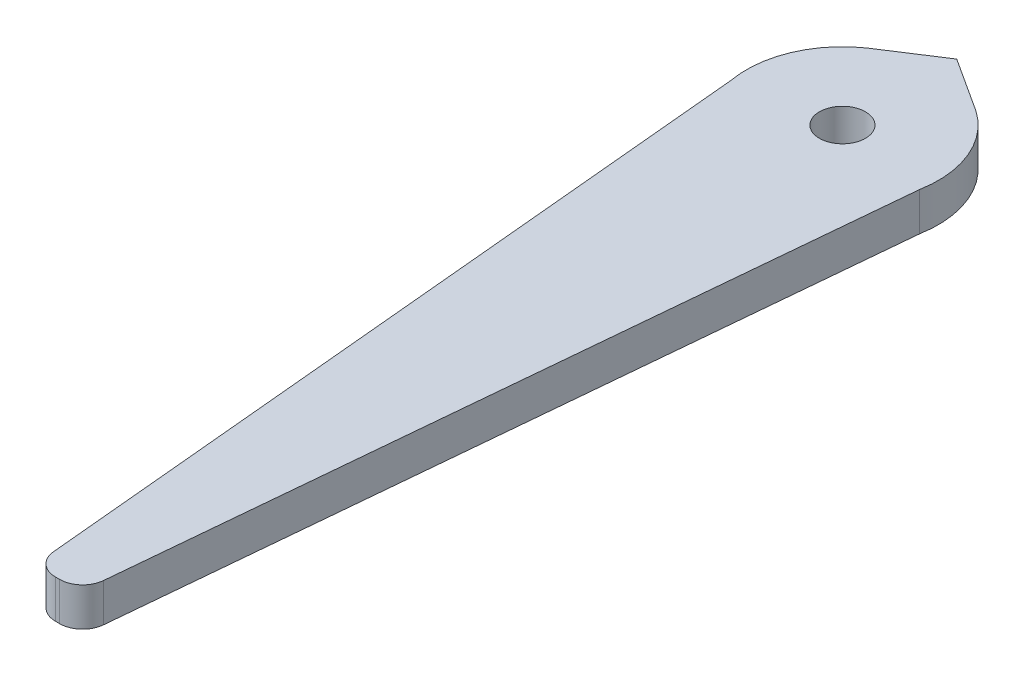
ISO-10303-21;
HEADER;
FILE_DESCRIPTION(('STEP AP214'),'2;1');
FILE_NAME('part.step','',(''),(''),'','','');
FILE_SCHEMA(('AUTOMOTIVE_DESIGN { 1 0 10303 214 1 1 1 1 }'));
ENDSEC;
DATA;
#1=APPLICATION_CONTEXT('core data for automotive mechanical design processes');
#2=APPLICATION_PROTOCOL_DEFINITION('international standard','automotive_design',2000,#1);
#3=PRODUCT_CONTEXT('',#1,'mechanical');
#4=PRODUCT('Part','Part','',(#3));
#5=PRODUCT_RELATED_PRODUCT_CATEGORY('part','',(#4));
#6=PRODUCT_DEFINITION_FORMATION('','',#4);
#7=PRODUCT_DEFINITION_CONTEXT('part definition',#1,'design');
#8=PRODUCT_DEFINITION('design','',#6,#7);
#9=PRODUCT_DEFINITION_SHAPE('','',#8);
#10=(LENGTH_UNIT() NAMED_UNIT(*) SI_UNIT(.MILLI.,.METRE.));
#11=(NAMED_UNIT(*) PLANE_ANGLE_UNIT() SI_UNIT($,.RADIAN.));
#12=(NAMED_UNIT(*) SI_UNIT($,.STERADIAN.) SOLID_ANGLE_UNIT());
#13=UNCERTAINTY_MEASURE_WITH_UNIT(LENGTH_MEASURE(1.E-05),#10,'distance_accuracy_value','');
#14=(GEOMETRIC_REPRESENTATION_CONTEXT(3) GLOBAL_UNCERTAINTY_ASSIGNED_CONTEXT((#13)) GLOBAL_UNIT_ASSIGNED_CONTEXT((#10,
#11,#12)) REPRESENTATION_CONTEXT('',''));
#15=CARTESIAN_POINT('',(0.,0.,0.));
#16=DIRECTION('',(0.,0.,1.));
#17=DIRECTION('',(1.,0.,0.));
#18=AXIS2_PLACEMENT_3D('',#15,#16,#17);
#19=CARTESIAN_POINT('',(-0.868497324803818,5.,-198.583153997755));
#20=DIRECTION('',(0.,1.,0.));
#21=DIRECTION('',(0.,0.,1.));
#22=AXIS2_PLACEMENT_3D('',#19,#20,#21);
#23=PLANE('',#22);
#24=DIRECTION('',(0.0925848011404224,0.,0.995704802940002));
#25=VECTOR('',#24,1.);
#26=CARTESIAN_POINT('',(-13.1669159793135,5.,-196.347332314702));
#27=LINE('',#26,#25);
#28=CARTESIAN_POINT('',(-13.1669159793135,5.,-196.347332314702));
#29=VERTEX_POINT('',#28);
#30=CARTESIAN_POINT('',(-4.12077936453641,5.,-99.0605037592925));
#31=VERTEX_POINT('',#30);
#32=EDGE_CURVE('E147',#29,#31,#27,.T.);
#33=ORIENTED_EDGE('',*,*,#32,.T.);
#34=CARTESIAN_POINT('',(-1.1436220037458,5.,-99.3373323147023));
#35=DIRECTION('',(0.,1.,0.));
#36=DIRECTION('',(0.,0.,1.));
#37=AXIS2_PLACEMENT_3D('',#34,#35,#36);
#38=CIRCLE('',#37,2.99);
#39=CARTESIAN_POINT('',(-1.1436220037458,5.,-96.3473323147023));
#40=VERTEX_POINT('',#39);
#41=EDGE_CURVE('E40',#31,#40,#38,.T.);
#42=ORIENTED_EDGE('',*,*,#41,.T.);
#43=DIRECTION('',(1.,0.,0.));
#44=VECTOR('',#43,1.);
#45=CARTESIAN_POINT('',(-3.86849732480381,5.,-96.3473323147023));
#46=LINE('',#45,#44);
#47=CARTESIAN_POINT('',(-0.593372645861814,5.,-96.3473323147023));
#48=VERTEX_POINT('',#47);
#49=EDGE_CURVE('E146',#40,#48,#46,.T.);
#50=ORIENTED_EDGE('',*,*,#49,.T.);
#51=CARTESIAN_POINT('',(-0.593372645861814,5.,-99.3373323147023));
#52=DIRECTION('',(0.,1.,0.));
#53=DIRECTION('',(0.,0.,1.));
#54=AXIS2_PLACEMENT_3D('',#51,#52,#53);
#55=CIRCLE('',#54,2.99);
#56=CARTESIAN_POINT('',(2.38378471492879,5.,-99.0605037592924));
#57=VERTEX_POINT('',#56);
#58=EDGE_CURVE('E47',#48,#57,#55,.T.);
#59=ORIENTED_EDGE('',*,*,#58,.T.);
#60=DIRECTION('',(0.0925848011404221,0.,-0.995704802940002));
#61=VECTOR('',#60,1.);
#62=CARTESIAN_POINT('',(2.13150267519619,5.,-96.3473323147023));
#63=LINE('',#62,#61);
#64=CARTESIAN_POINT('',(11.4299213297059,5.,-196.347332314702));
#65=VERTEX_POINT('',#64);
#66=EDGE_CURVE('E120',#57,#65,#63,.T.);
#67=ORIENTED_EDGE('',*,*,#66,.T.);
#68=CARTESIAN_POINT('',(-0.868497324803818,5.,-198.583153997755));
#69=DIRECTION('',(0.,1.,0.));
#70=DIRECTION('',(0.,0.,1.));
#71=AXIS2_PLACEMENT_3D('',#68,#69,#70);
#72=CIRCLE('',#71,12.5);
#73=CARTESIAN_POINT('',(6.22566236907417,5.,-208.875039065018));
#74=VERTEX_POINT('',#73);
#75=EDGE_CURVE('E116',#65,#74,#72,.T.);
#76=ORIENTED_EDGE('',*,*,#75,.T.);
#77=DIRECTION('',(-0.8392996785331,0.,-0.543669062587008));
#78=VECTOR('',#77,1.);
#79=CARTESIAN_POINT('',(-0.86849732480382,5.,-213.470388317807));
#80=LINE('',#79,#78);
#81=CARTESIAN_POINT('',(-0.86849732480382,5.,-213.470388317807));
#82=VERTEX_POINT('',#81);
#83=EDGE_CURVE('E106',#74,#82,#80,.T.);
#84=ORIENTED_EDGE('',*,*,#83,.T.);
#85=DIRECTION('',(-0.839299678533099,0.,0.543669062587009));
#86=VECTOR('',#85,1.);
#87=CARTESIAN_POINT('',(-7.96265701868184,5.,-208.875039065018));
#88=LINE('',#87,#86);
#89=CARTESIAN_POINT('',(-7.96265701868184,5.,-208.875039065018));
#90=VERTEX_POINT('',#89);
#91=EDGE_CURVE('E115',#82,#90,#88,.T.);
#92=ORIENTED_EDGE('',*,*,#91,.T.);
#93=CARTESIAN_POINT('',(-0.868497324803818,5.,-198.583153997755));
#94=DIRECTION('',(0.,1.,0.));
#95=DIRECTION('',(0.,0.,1.));
#96=AXIS2_PLACEMENT_3D('',#93,#94,#95);
#97=CIRCLE('',#96,12.5);
#98=EDGE_CURVE('E183',#90,#29,#97,.T.);
#99=ORIENTED_EDGE('',*,*,#98,.T.);
#100=EDGE_LOOP('',(#33,#42,#50,#59,#67,#76,#84,#92,#99));
#101=FACE_BOUND('',#100,.T.);
#102=CARTESIAN_POINT('',(-0.868497324803818,5.,-198.583153997755));
#103=DIRECTION('',(0.,1.,0.));
#104=DIRECTION('',(0.,0.,1.));
#105=AXIS2_PLACEMENT_3D('',#102,#103,#104);
#106=CIRCLE('',#105,3.00000000012173);
#107=CARTESIAN_POINT('',(-0.868497324803818,5.,-195.583153997633));
#108=VERTEX_POINT('',#107);
#109=EDGE_CURVE('E190',#108,#108,#106,.T.);
#110=ORIENTED_EDGE('',*,*,#109,.F.);
#111=EDGE_LOOP('',(#110));
#112=FACE_BOUND('',#111,.T.);
#113=ADVANCED_FACE('F32',(#101,#112),#23,.T.);
#114=CARTESIAN_POINT('',(-0.868497324803818,0.,-198.583153997755));
#115=DIRECTION('',(0.,1.,0.));
#116=DIRECTION('',(0.,0.,1.));
#117=AXIS2_PLACEMENT_3D('',#114,#115,#116);
#118=PLANE('',#117);
#119=DIRECTION('',(1.,0.,0.));
#120=VECTOR('',#119,1.);
#121=CARTESIAN_POINT('',(-3.86849732480381,0.,-96.3473323147023));
#122=LINE('',#121,#120);
#123=CARTESIAN_POINT('',(-1.1436220037458,0.,-96.3473323147023));
#124=VERTEX_POINT('',#123);
#125=CARTESIAN_POINT('',(-0.593372645861814,0.,-96.3473323147023));
#126=VERTEX_POINT('',#125);
#127=EDGE_CURVE('E163',#124,#126,#122,.T.);
#128=ORIENTED_EDGE('',*,*,#127,.F.);
#129=CARTESIAN_POINT('',(-1.1436220037458,0.,-99.3373323147023));
#130=DIRECTION('',(0.,1.,0.));
#131=DIRECTION('',(0.,0.,1.));
#132=AXIS2_PLACEMENT_3D('',#129,#130,#131);
#133=CIRCLE('',#132,2.99);
#134=CARTESIAN_POINT('',(-4.12077936453641,0.,-99.0605037592925));
#135=VERTEX_POINT('',#134);
#136=EDGE_CURVE('E141',#124,#135,#133,.F.);
#137=ORIENTED_EDGE('',*,*,#136,.T.);
#138=DIRECTION('',(0.0925848011404224,0.,0.995704802940002));
#139=VECTOR('',#138,1.);
#140=CARTESIAN_POINT('',(-13.1669159793135,0.,-196.347332314702));
#141=LINE('',#140,#139);
#142=CARTESIAN_POINT('',(-13.1669159793135,0.,-196.347332314702));
#143=VERTEX_POINT('',#142);
#144=EDGE_CURVE('E162',#143,#135,#141,.T.);
#145=ORIENTED_EDGE('',*,*,#144,.F.);
#146=CARTESIAN_POINT('',(-0.868497324803818,0.,-198.583153997755));
#147=DIRECTION('',(0.,1.,0.));
#148=DIRECTION('',(0.,0.,1.));
#149=AXIS2_PLACEMENT_3D('',#146,#147,#148);
#150=CIRCLE('',#149,12.5);
#151=CARTESIAN_POINT('',(-7.96265701868184,0.,-208.875039065018));
#152=VERTEX_POINT('',#151);
#153=EDGE_CURVE('E168',#152,#143,#150,.T.);
#154=ORIENTED_EDGE('',*,*,#153,.F.);
#155=DIRECTION('',(-0.839299678533099,0.,0.543669062587009));
#156=VECTOR('',#155,1.);
#157=CARTESIAN_POINT('',(-7.96265701868184,0.,-208.875039065018));
#158=LINE('',#157,#156);
#159=CARTESIAN_POINT('',(-0.86849732480382,0.,-213.470388317807));
#160=VERTEX_POINT('',#159);
#161=EDGE_CURVE('E171',#160,#152,#158,.T.);
#162=ORIENTED_EDGE('',*,*,#161,.F.);
#163=DIRECTION('',(-0.8392996785331,0.,-0.543669062587008));
#164=VECTOR('',#163,1.);
#165=CARTESIAN_POINT('',(-0.86849732480382,0.,-213.470388317807));
#166=LINE('',#165,#164);
#167=CARTESIAN_POINT('',(6.22566236907417,0.,-208.875039065018));
#168=VERTEX_POINT('',#167);
#169=EDGE_CURVE('E186',#168,#160,#166,.T.);
#170=ORIENTED_EDGE('',*,*,#169,.F.);
#171=CARTESIAN_POINT('',(-0.868497324803818,0.,-198.583153997755));
#172=DIRECTION('',(0.,1.,0.));
#173=DIRECTION('',(0.,0.,1.));
#174=AXIS2_PLACEMENT_3D('',#171,#172,#173);
#175=CIRCLE('',#174,12.5);
#176=CARTESIAN_POINT('',(11.4299213297059,0.,-196.347332314702));
#177=VERTEX_POINT('',#176);
#178=EDGE_CURVE('E128',#177,#168,#175,.T.);
#179=ORIENTED_EDGE('',*,*,#178,.F.);
#180=DIRECTION('',(0.0925848011404221,0.,-0.995704802940002));
#181=VECTOR('',#180,1.);
#182=CARTESIAN_POINT('',(2.13150267519619,0.,-96.3473323147023));
#183=LINE('',#182,#181);
#184=CARTESIAN_POINT('',(2.38378471492879,0.,-99.0605037592924));
#185=VERTEX_POINT('',#184);
#186=EDGE_CURVE('E124',#185,#177,#183,.T.);
#187=ORIENTED_EDGE('',*,*,#186,.F.);
#188=CARTESIAN_POINT('',(-0.593372645861814,0.,-99.3373323147023));
#189=DIRECTION('',(0.,1.,0.));
#190=DIRECTION('',(0.,0.,1.));
#191=AXIS2_PLACEMENT_3D('',#188,#189,#190);
#192=CIRCLE('',#191,2.99);
#193=EDGE_CURVE('E139',#185,#126,#192,.F.);
#194=ORIENTED_EDGE('',*,*,#193,.T.);
#195=EDGE_LOOP('',(#128,#137,#145,#154,#162,#170,#179,#187,#194));
#196=FACE_BOUND('',#195,.T.);
#197=CARTESIAN_POINT('',(-0.868497324803818,0.,-198.583153997755));
#198=DIRECTION('',(0.,1.,0.));
#199=DIRECTION('',(0.,0.,1.));
#200=AXIS2_PLACEMENT_3D('',#197,#198,#199);
#201=CIRCLE('',#200,3.00000000012173);
#202=CARTESIAN_POINT('',(-0.868497324803818,0.,-195.583153997633));
#203=VERTEX_POINT('',#202);
#204=EDGE_CURVE('E195',#203,#203,#201,.T.);
#205=ORIENTED_EDGE('',*,*,#204,.T.);
#206=EDGE_LOOP('',(#205));
#207=FACE_BOUND('',#206,.T.);
#208=ADVANCED_FACE('F159',(#196,#207),#118,.F.);
#209=CARTESIAN_POINT('',(-0.868497324803818,5.,-198.583153997755));
#210=DIRECTION('',(0.,-1.,0.));
#211=DIRECTION('',(0.,0.,-1.));
#212=AXIS2_PLACEMENT_3D('',#209,#210,#211);
#213=CYLINDRICAL_SURFACE('',#212,12.5);
#214=ORIENTED_EDGE('',*,*,#178,.T.);
#215=DIRECTION('',(0.,-1.,0.));
#216=VECTOR('',#215,1.);
#217=CARTESIAN_POINT('',(6.22566236907417,5.,-208.875039065018));
#218=LINE('',#217,#216);
#219=EDGE_CURVE('E110',#74,#168,#218,.T.);
#220=ORIENTED_EDGE('',*,*,#219,.F.);
#221=ORIENTED_EDGE('',*,*,#75,.F.);
#222=DIRECTION('',(0.,-1.,0.));
#223=VECTOR('',#222,1.);
#224=CARTESIAN_POINT('',(11.4299213297059,5.,-196.347332314702));
#225=LINE('',#224,#223);
#226=EDGE_CURVE('E176',#65,#177,#225,.T.);
#227=ORIENTED_EDGE('',*,*,#226,.T.);
#228=EDGE_LOOP('',(#214,#220,#221,#227));
#229=FACE_BOUND('',#228,.T.);
#230=ADVANCED_FACE('F126',(#229),#213,.T.);
#231=CARTESIAN_POINT('',(-0.86849732480382,5.,-213.470388317807));
#232=DIRECTION('',(-0.543669062587008,0.,0.8392996785331));
#233=DIRECTION('',(0.8392996785331,0.,0.543669062587008));
#234=AXIS2_PLACEMENT_3D('',#231,#232,#233);
#235=PLANE('',#234);
#236=ORIENTED_EDGE('',*,*,#169,.T.);
#237=DIRECTION('',(0.,-1.,0.));
#238=VECTOR('',#237,1.);
#239=CARTESIAN_POINT('',(-0.86849732480382,5.,-213.470388317807));
#240=LINE('',#239,#238);
#241=EDGE_CURVE('E113',#82,#160,#240,.T.);
#242=ORIENTED_EDGE('',*,*,#241,.F.);
#243=ORIENTED_EDGE('',*,*,#83,.F.);
#244=ORIENTED_EDGE('',*,*,#219,.T.);
#245=EDGE_LOOP('',(#236,#242,#243,#244));
#246=FACE_BOUND('',#245,.T.);
#247=ADVANCED_FACE('F108',(#246),#235,.F.);
#248=CARTESIAN_POINT('',(-7.96265701868184,5.,-208.875039065018));
#249=DIRECTION('',(0.543669062587009,0.,0.839299678533099));
#250=DIRECTION('',(0.839299678533099,0.,-0.543669062587009));
#251=AXIS2_PLACEMENT_3D('',#248,#249,#250);
#252=PLANE('',#251);
#253=ORIENTED_EDGE('',*,*,#161,.T.);
#254=DIRECTION('',(0.,-1.,0.));
#255=VECTOR('',#254,1.);
#256=CARTESIAN_POINT('',(-7.96265701868184,5.,-208.875039065018));
#257=LINE('',#256,#255);
#258=EDGE_CURVE('E133',#90,#152,#257,.T.);
#259=ORIENTED_EDGE('',*,*,#258,.F.);
#260=ORIENTED_EDGE('',*,*,#91,.F.);
#261=ORIENTED_EDGE('',*,*,#241,.T.);
#262=EDGE_LOOP('',(#253,#259,#260,#261));
#263=FACE_BOUND('',#262,.T.);
#264=ADVANCED_FACE('F221',(#263),#252,.F.);
#265=CARTESIAN_POINT('',(-0.868497324803818,5.,-198.583153997755));
#266=DIRECTION('',(0.,-1.,0.));
#267=DIRECTION('',(0.,0.,-1.));
#268=AXIS2_PLACEMENT_3D('',#265,#266,#267);
#269=CYLINDRICAL_SURFACE('',#268,12.5);
#270=ORIENTED_EDGE('',*,*,#153,.T.);
#271=DIRECTION('',(0.,-1.,0.));
#272=VECTOR('',#271,1.);
#273=CARTESIAN_POINT('',(-13.1669159793135,5.,-196.347332314702));
#274=LINE('',#273,#272);
#275=EDGE_CURVE('E167',#29,#143,#274,.T.);
#276=ORIENTED_EDGE('',*,*,#275,.F.);
#277=ORIENTED_EDGE('',*,*,#98,.F.);
#278=ORIENTED_EDGE('',*,*,#258,.T.);
#279=EDGE_LOOP('',(#270,#276,#277,#278));
#280=FACE_BOUND('',#279,.T.);
#281=ADVANCED_FACE('F182',(#280),#269,.T.);
#282=CARTESIAN_POINT('',(-13.1669159793135,5.,-196.347332314702));
#283=DIRECTION('',(0.995704802940002,0.,-0.0925848011404224));
#284=DIRECTION('',(-0.0925848011404224,0.,-0.995704802940002));
#285=AXIS2_PLACEMENT_3D('',#282,#283,#284);
#286=PLANE('',#285);
#287=ORIENTED_EDGE('',*,*,#144,.T.);
#288=DIRECTION('',(0.,-1.,0.));
#289=VECTOR('',#288,1.);
#290=CARTESIAN_POINT('',(-4.12077936453641,5.,-99.0605037592925));
#291=LINE('',#290,#289);
#292=EDGE_CURVE('E55',#135,#31,#291,.F.);
#293=ORIENTED_EDGE('',*,*,#292,.T.);
#294=ORIENTED_EDGE('',*,*,#32,.F.);
#295=ORIENTED_EDGE('',*,*,#275,.T.);
#296=EDGE_LOOP('',(#287,#293,#294,#295));
#297=FACE_BOUND('',#296,.T.);
#298=ADVANCED_FACE('F165',(#297),#286,.F.);
#299=CARTESIAN_POINT('',(-3.86849732480381,5.,-96.3473323147023));
#300=DIRECTION('',(0.,0.,-1.));
#301=DIRECTION('',(-1.,0.,0.));
#302=AXIS2_PLACEMENT_3D('',#299,#300,#301);
#303=PLANE('',#302);
#304=ORIENTED_EDGE('',*,*,#49,.F.);
#305=DIRECTION('',(0.,-1.,0.));
#306=VECTOR('',#305,1.);
#307=CARTESIAN_POINT('',(-1.1436220037458,5.,-96.3473323147023));
#308=LINE('',#307,#306);
#309=EDGE_CURVE('E131',#40,#124,#308,.T.);
#310=ORIENTED_EDGE('',*,*,#309,.T.);
#311=ORIENTED_EDGE('',*,*,#127,.T.);
#312=DIRECTION('',(0.,-1.,0.));
#313=VECTOR('',#312,1.);
#314=CARTESIAN_POINT('',(-0.593372645861814,5.,-96.3473323147023));
#315=LINE('',#314,#313);
#316=EDGE_CURVE('E129',#126,#48,#315,.F.);
#317=ORIENTED_EDGE('',*,*,#316,.T.);
#318=EDGE_LOOP('',(#304,#310,#311,#317));
#319=FACE_BOUND('',#318,.T.);
#320=ADVANCED_FACE('F151',(#319),#303,.F.);
#321=CARTESIAN_POINT('',(2.13150267519619,5.,-96.3473323147023));
#322=DIRECTION('',(-0.995704802940002,0.,-0.0925848011404221));
#323=DIRECTION('',(-0.0925848011404221,0.,0.995704802940002));
#324=AXIS2_PLACEMENT_3D('',#321,#322,#323);
#325=PLANE('',#324);
#326=ORIENTED_EDGE('',*,*,#66,.F.);
#327=DIRECTION('',(0.,-1.,0.));
#328=VECTOR('',#327,1.);
#329=CARTESIAN_POINT('',(2.38378471492879,5.,-99.0605037592924));
#330=LINE('',#329,#328);
#331=EDGE_CURVE('E11',#57,#185,#330,.T.);
#332=ORIENTED_EDGE('',*,*,#331,.T.);
#333=ORIENTED_EDGE('',*,*,#186,.T.);
#334=ORIENTED_EDGE('',*,*,#226,.F.);
#335=EDGE_LOOP('',(#326,#332,#333,#334));
#336=FACE_BOUND('',#335,.T.);
#337=ADVANCED_FACE('F211',(#336),#325,.F.);
#338=CARTESIAN_POINT('',(-0.868497324803818,5.,-198.583153997755));
#339=DIRECTION('',(0.,-1.,0.));
#340=DIRECTION('',(0.,0.,-1.));
#341=AXIS2_PLACEMENT_3D('',#338,#339,#340);
#342=CYLINDRICAL_SURFACE('',#341,3.00000000012173);
#343=ORIENTED_EDGE('',*,*,#109,.T.);
#344=EDGE_LOOP('',(#343));
#345=FACE_BOUND('',#344,.T.);
#346=ORIENTED_EDGE('',*,*,#204,.F.);
#347=EDGE_LOOP('',(#346));
#348=FACE_BOUND('',#347,.T.);
#349=ADVANCED_FACE('F201',(#345,#348),#342,.F.);
#350=CARTESIAN_POINT('',(-1.1436220037458,5.,-99.3373323147023));
#351=DIRECTION('',(0.,-1.,0.));
#352=DIRECTION('',(0.,0.,-1.));
#353=AXIS2_PLACEMENT_3D('',#350,#351,#352);
#354=CYLINDRICAL_SURFACE('',#353,2.99);
#355=ORIENTED_EDGE('',*,*,#41,.F.);
#356=ORIENTED_EDGE('',*,*,#292,.F.);
#357=ORIENTED_EDGE('',*,*,#136,.F.);
#358=ORIENTED_EDGE('',*,*,#309,.F.);
#359=EDGE_LOOP('',(#355,#356,#357,#358));
#360=FACE_BOUND('',#359,.T.);
#361=ADVANCED_FACE('F156',(#360),#354,.T.);
#362=CARTESIAN_POINT('',(-0.593372645861814,5.,-99.3373323147023));
#363=DIRECTION('',(0.,-1.,0.));
#364=DIRECTION('',(0.,0.,-1.));
#365=AXIS2_PLACEMENT_3D('',#362,#363,#364);
#366=CYLINDRICAL_SURFACE('',#365,2.99);
#367=ORIENTED_EDGE('',*,*,#58,.F.);
#368=ORIENTED_EDGE('',*,*,#316,.F.);
#369=ORIENTED_EDGE('',*,*,#193,.F.);
#370=ORIENTED_EDGE('',*,*,#331,.F.);
#371=EDGE_LOOP('',(#367,#368,#369,#370));
#372=FACE_BOUND('',#371,.T.);
#373=ADVANCED_FACE('F34',(#372),#366,.T.);
#374=CLOSED_SHELL('',(#113,#208,#230,#247,#264,#281,#298,#320,#337,#349,#361,#373));
#375=MANIFOLD_SOLID_BREP('B2',#374);
#376=ADVANCED_BREP_SHAPE_REPRESENTATION('',(#18,#375),#14);
#377=SHAPE_DEFINITION_REPRESENTATION(#9,#376);
ENDSEC;
END-ISO-10303-21;
